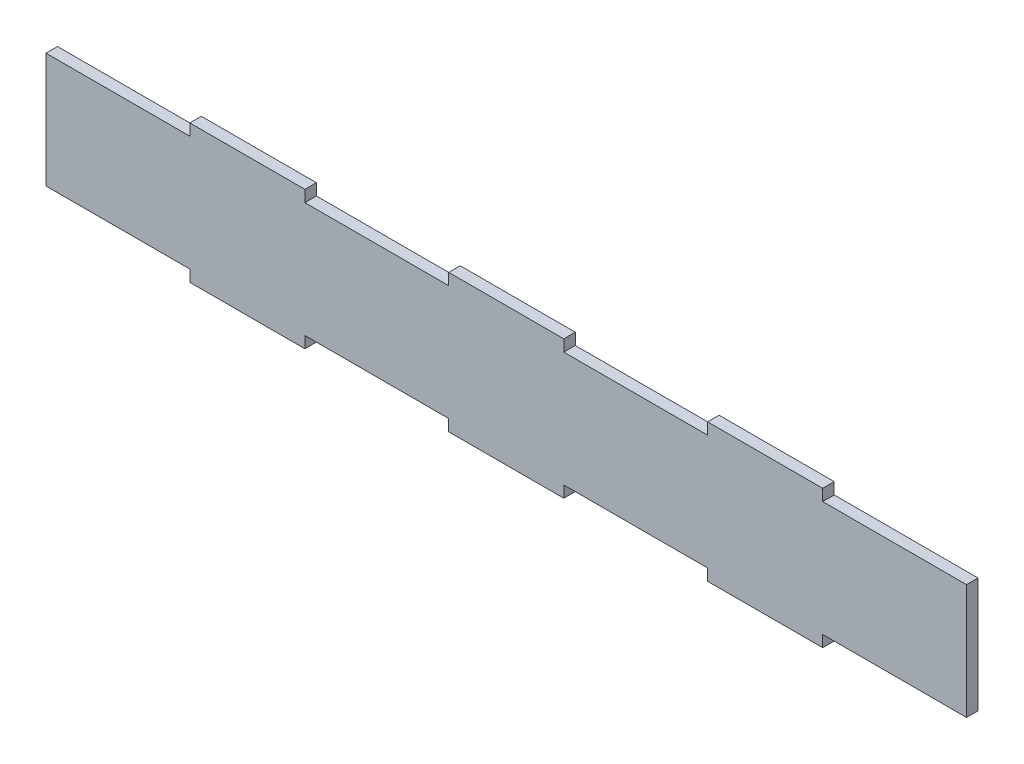
ISO-10303-21;
HEADER;
FILE_DESCRIPTION(('STEP AP214'),'2;1');
FILE_NAME('part.step','',(''),(''),'','','');
FILE_SCHEMA(('AUTOMOTIVE_DESIGN { 1 0 10303 214 1 1 1 1 }'));
ENDSEC;
DATA;
#1=APPLICATION_CONTEXT('core data for automotive mechanical design processes');
#2=APPLICATION_PROTOCOL_DEFINITION('international standard','automotive_design',2000,#1);
#3=PRODUCT_CONTEXT('',#1,'mechanical');
#4=PRODUCT('Part','Part','',(#3));
#5=PRODUCT_RELATED_PRODUCT_CATEGORY('part','',(#4));
#6=PRODUCT_DEFINITION_FORMATION('','',#4);
#7=PRODUCT_DEFINITION_CONTEXT('part definition',#1,'design');
#8=PRODUCT_DEFINITION('design','',#6,#7);
#9=PRODUCT_DEFINITION_SHAPE('','',#8);
#10=(LENGTH_UNIT() NAMED_UNIT(*) SI_UNIT(.MILLI.,.METRE.));
#11=(NAMED_UNIT(*) PLANE_ANGLE_UNIT() SI_UNIT($,.RADIAN.));
#12=(NAMED_UNIT(*) SI_UNIT($,.STERADIAN.) SOLID_ANGLE_UNIT());
#13=UNCERTAINTY_MEASURE_WITH_UNIT(LENGTH_MEASURE(1.E-05),#10,'distance_accuracy_value','');
#14=(GEOMETRIC_REPRESENTATION_CONTEXT(3) GLOBAL_UNCERTAINTY_ASSIGNED_CONTEXT((#13)) GLOBAL_UNIT_ASSIGNED_CONTEXT((#10,
#11,#12)) REPRESENTATION_CONTEXT('',''));
#15=CARTESIAN_POINT('',(0.,0.,0.));
#16=DIRECTION('',(0.,0.,1.));
#17=DIRECTION('',(1.,0.,0.));
#18=AXIS2_PLACEMENT_3D('',#15,#16,#17);
#19=CARTESIAN_POINT('',(0.,0.,2.));
#20=DIRECTION('',(0.,1.,0.));
#21=DIRECTION('',(0.,0.,1.));
#22=AXIS2_PLACEMENT_3D('',#19,#20,#21);
#23=PLANE('',#22);
#24=DIRECTION('',(1.,0.,0.));
#25=VECTOR('',#24,1.);
#26=CARTESIAN_POINT('',(0.,0.,0.));
#27=LINE('',#26,#25);
#28=CARTESIAN_POINT('',(115.,0.,0.));
#29=VERTEX_POINT('',#28);
#30=CARTESIAN_POINT('',(135.,0.,0.));
#31=VERTEX_POINT('',#30);
#32=EDGE_CURVE('E254',#29,#31,#27,.T.);
#33=ORIENTED_EDGE('',*,*,#32,.T.);
#34=DIRECTION('',(0.,0.,-1.));
#35=VECTOR('',#34,1.);
#36=CARTESIAN_POINT('',(135.,0.,2.));
#37=LINE('',#36,#35);
#38=CARTESIAN_POINT('',(135.,0.,2.));
#39=VERTEX_POINT('',#38);
#40=EDGE_CURVE('E11',#39,#31,#37,.T.);
#41=ORIENTED_EDGE('',*,*,#40,.F.);
#42=DIRECTION('',(1.,0.,0.));
#43=VECTOR('',#42,1.);
#44=CARTESIAN_POINT('',(0.,0.,2.));
#45=LINE('',#44,#43);
#46=CARTESIAN_POINT('',(115.,0.,2.));
#47=VERTEX_POINT('',#46);
#48=EDGE_CURVE('E324',#47,#39,#45,.T.);
#49=ORIENTED_EDGE('',*,*,#48,.F.);
#50=DIRECTION('',(0.,0.,-1.));
#51=VECTOR('',#50,1.);
#52=CARTESIAN_POINT('',(115.,0.,2.));
#53=LINE('',#52,#51);
#54=EDGE_CURVE('E52',#47,#29,#53,.T.);
#55=ORIENTED_EDGE('',*,*,#54,.T.);
#56=EDGE_LOOP('',(#33,#41,#49,#55));
#57=FACE_BOUND('',#56,.T.);
#58=ADVANCED_FACE('F35',(#57),#23,.F.);
#59=CARTESIAN_POINT('',(135.,0.,2.));
#60=DIRECTION('',(-1.,0.,0.));
#61=DIRECTION('',(0.,0.,1.));
#62=AXIS2_PLACEMENT_3D('',#59,#60,#61);
#63=PLANE('',#62);
#64=DIRECTION('',(0.,1.,0.));
#65=VECTOR('',#64,1.);
#66=CARTESIAN_POINT('',(135.,0.,0.));
#67=LINE('',#66,#65);
#68=CARTESIAN_POINT('',(135.,2.,0.));
#69=VERTEX_POINT('',#68);
#70=EDGE_CURVE('E256',#31,#69,#67,.T.);
#71=ORIENTED_EDGE('',*,*,#70,.T.);
#72=DIRECTION('',(0.,0.,-1.));
#73=VECTOR('',#72,1.);
#74=CARTESIAN_POINT('',(135.,2.,2.));
#75=LINE('',#74,#73);
#76=CARTESIAN_POINT('',(135.,2.,2.));
#77=VERTEX_POINT('',#76);
#78=EDGE_CURVE('E44',#77,#69,#75,.T.);
#79=ORIENTED_EDGE('',*,*,#78,.F.);
#80=DIRECTION('',(0.,1.,0.));
#81=VECTOR('',#80,1.);
#82=CARTESIAN_POINT('',(135.,0.,2.));
#83=LINE('',#82,#81);
#84=EDGE_CURVE('E151',#39,#77,#83,.T.);
#85=ORIENTED_EDGE('',*,*,#84,.F.);
#86=ORIENTED_EDGE('',*,*,#40,.T.);
#87=EDGE_LOOP('',(#71,#79,#85,#86));
#88=FACE_BOUND('',#87,.T.);
#89=ADVANCED_FACE('F37',(#88),#63,.F.);
#90=CARTESIAN_POINT('',(0.,2.,2.));
#91=DIRECTION('',(0.,-1.,0.));
#92=DIRECTION('',(0.,0.,-1.));
#93=AXIS2_PLACEMENT_3D('',#90,#91,#92);
#94=PLANE('',#93);
#95=DIRECTION('',(-1.,0.,0.));
#96=VECTOR('',#95,1.);
#97=CARTESIAN_POINT('',(0.,2.,0.));
#98=LINE('',#97,#96);
#99=CARTESIAN_POINT('',(160.,2.,0.));
#100=VERTEX_POINT('',#99);
#101=EDGE_CURVE('E261',#100,#69,#98,.T.);
#102=ORIENTED_EDGE('',*,*,#101,.F.);
#103=DIRECTION('',(0.,0.,-1.));
#104=VECTOR('',#103,1.);
#105=CARTESIAN_POINT('',(160.,2.,2.));
#106=LINE('',#105,#104);
#107=CARTESIAN_POINT('',(160.,2.,2.));
#108=VERTEX_POINT('',#107);
#109=EDGE_CURVE('E373',#108,#100,#106,.T.);
#110=ORIENTED_EDGE('',*,*,#109,.F.);
#111=DIRECTION('',(-1.,0.,0.));
#112=VECTOR('',#111,1.);
#113=CARTESIAN_POINT('',(0.,2.,2.));
#114=LINE('',#113,#112);
#115=EDGE_CURVE('E379',#108,#77,#114,.T.);
#116=ORIENTED_EDGE('',*,*,#115,.T.);
#117=ORIENTED_EDGE('',*,*,#78,.T.);
#118=EDGE_LOOP('',(#102,#110,#116,#117));
#119=FACE_BOUND('',#118,.T.);
#120=ADVANCED_FACE('F377',(#119),#94,.T.);
#121=CARTESIAN_POINT('',(160.,0.,2.));
#122=DIRECTION('',(-1.,0.,0.));
#123=DIRECTION('',(0.,0.,1.));
#124=AXIS2_PLACEMENT_3D('',#121,#122,#123);
#125=PLANE('',#124);
#126=DIRECTION('',(0.,1.,0.));
#127=VECTOR('',#126,1.);
#128=CARTESIAN_POINT('',(160.,0.,0.));
#129=LINE('',#128,#127);
#130=CARTESIAN_POINT('',(160.,22.,0.));
#131=VERTEX_POINT('',#130);
#132=EDGE_CURVE('E264',#100,#131,#129,.T.);
#133=ORIENTED_EDGE('',*,*,#132,.T.);
#134=DIRECTION('',(0.,0.,-1.));
#135=VECTOR('',#134,1.);
#136=CARTESIAN_POINT('',(160.,22.,2.));
#137=LINE('',#136,#135);
#138=CARTESIAN_POINT('',(160.,22.,2.));
#139=VERTEX_POINT('',#138);
#140=EDGE_CURVE('E370',#139,#131,#137,.T.);
#141=ORIENTED_EDGE('',*,*,#140,.F.);
#142=DIRECTION('',(0.,1.,0.));
#143=VECTOR('',#142,1.);
#144=CARTESIAN_POINT('',(160.,0.,2.));
#145=LINE('',#144,#143);
#146=EDGE_CURVE('E397',#108,#139,#145,.T.);
#147=ORIENTED_EDGE('',*,*,#146,.F.);
#148=ORIENTED_EDGE('',*,*,#109,.T.);
#149=EDGE_LOOP('',(#133,#141,#147,#148));
#150=FACE_BOUND('',#149,.T.);
#151=ADVANCED_FACE('F387',(#150),#125,.F.);
#152=CARTESIAN_POINT('',(0.,22.,2.));
#153=DIRECTION('',(0.,-1.,0.));
#154=DIRECTION('',(0.,0.,-1.));
#155=AXIS2_PLACEMENT_3D('',#152,#153,#154);
#156=PLANE('',#155);
#157=DIRECTION('',(-1.,0.,0.));
#158=VECTOR('',#157,1.);
#159=CARTESIAN_POINT('',(0.,22.,0.));
#160=LINE('',#159,#158);
#161=CARTESIAN_POINT('',(135.,22.,0.));
#162=VERTEX_POINT('',#161);
#163=EDGE_CURVE('E266',#131,#162,#160,.T.);
#164=ORIENTED_EDGE('',*,*,#163,.T.);
#165=DIRECTION('',(0.,0.,-1.));
#166=VECTOR('',#165,1.);
#167=CARTESIAN_POINT('',(135.,22.,2.));
#168=LINE('',#167,#166);
#169=CARTESIAN_POINT('',(135.,22.,2.));
#170=VERTEX_POINT('',#169);
#171=EDGE_CURVE('E368',#170,#162,#168,.T.);
#172=ORIENTED_EDGE('',*,*,#171,.F.);
#173=DIRECTION('',(-1.,0.,0.));
#174=VECTOR('',#173,1.);
#175=CARTESIAN_POINT('',(0.,22.,2.));
#176=LINE('',#175,#174);
#177=EDGE_CURVE('E393',#139,#170,#176,.T.);
#178=ORIENTED_EDGE('',*,*,#177,.F.);
#179=ORIENTED_EDGE('',*,*,#140,.T.);
#180=EDGE_LOOP('',(#164,#172,#178,#179));
#181=FACE_BOUND('',#180,.T.);
#182=ADVANCED_FACE('F391',(#181),#156,.F.);
#183=CARTESIAN_POINT('',(135.,0.,2.));
#184=DIRECTION('',(1.,0.,0.));
#185=DIRECTION('',(0.,0.,-1.));
#186=AXIS2_PLACEMENT_3D('',#183,#184,#185);
#187=PLANE('',#186);
#188=DIRECTION('',(0.,-1.,0.));
#189=VECTOR('',#188,1.);
#190=CARTESIAN_POINT('',(135.,0.,0.));
#191=LINE('',#190,#189);
#192=CARTESIAN_POINT('',(135.,24.,0.));
#193=VERTEX_POINT('',#192);
#194=EDGE_CURVE('E269',#193,#162,#191,.T.);
#195=ORIENTED_EDGE('',*,*,#194,.F.);
#196=DIRECTION('',(0.,0.,-1.));
#197=VECTOR('',#196,1.);
#198=CARTESIAN_POINT('',(135.,24.,2.));
#199=LINE('',#198,#197);
#200=CARTESIAN_POINT('',(135.,24.,2.));
#201=VERTEX_POINT('',#200);
#202=EDGE_CURVE('E366',#201,#193,#199,.T.);
#203=ORIENTED_EDGE('',*,*,#202,.F.);
#204=DIRECTION('',(0.,-1.,0.));
#205=VECTOR('',#204,1.);
#206=CARTESIAN_POINT('',(135.,0.,2.));
#207=LINE('',#206,#205);
#208=EDGE_CURVE('E396',#201,#170,#207,.T.);
#209=ORIENTED_EDGE('',*,*,#208,.T.);
#210=ORIENTED_EDGE('',*,*,#171,.T.);
#211=EDGE_LOOP('',(#195,#203,#209,#210));
#212=FACE_BOUND('',#211,.T.);
#213=ADVANCED_FACE('F541',(#212),#187,.T.);
#214=CARTESIAN_POINT('',(0.,24.,2.));
#215=DIRECTION('',(0.,1.,0.));
#216=DIRECTION('',(0.,0.,1.));
#217=AXIS2_PLACEMENT_3D('',#214,#215,#216);
#218=PLANE('',#217);
#219=DIRECTION('',(1.,0.,0.));
#220=VECTOR('',#219,1.);
#221=CARTESIAN_POINT('',(0.,24.,0.));
#222=LINE('',#221,#220);
#223=CARTESIAN_POINT('',(115.,24.,0.));
#224=VERTEX_POINT('',#223);
#225=EDGE_CURVE('E272',#224,#193,#222,.T.);
#226=ORIENTED_EDGE('',*,*,#225,.F.);
#227=DIRECTION('',(0.,0.,-1.));
#228=VECTOR('',#227,1.);
#229=CARTESIAN_POINT('',(115.,24.,2.));
#230=LINE('',#229,#228);
#231=CARTESIAN_POINT('',(115.,24.,2.));
#232=VERTEX_POINT('',#231);
#233=EDGE_CURVE('E364',#232,#224,#230,.T.);
#234=ORIENTED_EDGE('',*,*,#233,.F.);
#235=DIRECTION('',(1.,0.,0.));
#236=VECTOR('',#235,1.);
#237=CARTESIAN_POINT('',(0.,24.,2.));
#238=LINE('',#237,#236);
#239=EDGE_CURVE('E399',#232,#201,#238,.T.);
#240=ORIENTED_EDGE('',*,*,#239,.T.);
#241=ORIENTED_EDGE('',*,*,#202,.T.);
#242=EDGE_LOOP('',(#226,#234,#240,#241));
#243=FACE_BOUND('',#242,.T.);
#244=ADVANCED_FACE('F536',(#243),#218,.T.);
#245=CARTESIAN_POINT('',(115.,0.,2.));
#246=DIRECTION('',(1.,0.,0.));
#247=DIRECTION('',(0.,0.,-1.));
#248=AXIS2_PLACEMENT_3D('',#245,#246,#247);
#249=PLANE('',#248);
#250=DIRECTION('',(0.,-1.,0.));
#251=VECTOR('',#250,1.);
#252=CARTESIAN_POINT('',(115.,0.,0.));
#253=LINE('',#252,#251);
#254=CARTESIAN_POINT('',(115.,22.,0.));
#255=VERTEX_POINT('',#254);
#256=EDGE_CURVE('E275',#224,#255,#253,.T.);
#257=ORIENTED_EDGE('',*,*,#256,.T.);
#258=DIRECTION('',(0.,0.,-1.));
#259=VECTOR('',#258,1.);
#260=CARTESIAN_POINT('',(115.,22.,2.));
#261=LINE('',#260,#259);
#262=CARTESIAN_POINT('',(115.,22.,2.));
#263=VERTEX_POINT('',#262);
#264=EDGE_CURVE('E362',#263,#255,#261,.T.);
#265=ORIENTED_EDGE('',*,*,#264,.F.);
#266=DIRECTION('',(0.,-1.,0.));
#267=VECTOR('',#266,1.);
#268=CARTESIAN_POINT('',(115.,0.,2.));
#269=LINE('',#268,#267);
#270=EDGE_CURVE('E406',#232,#263,#269,.T.);
#271=ORIENTED_EDGE('',*,*,#270,.F.);
#272=ORIENTED_EDGE('',*,*,#233,.T.);
#273=EDGE_LOOP('',(#257,#265,#271,#272));
#274=FACE_BOUND('',#273,.T.);
#275=ADVANCED_FACE('F542',(#274),#249,.F.);
#276=CARTESIAN_POINT('',(0.,22.,2.));
#277=DIRECTION('',(0.,1.,0.));
#278=DIRECTION('',(-1.,0.,0.));
#279=AXIS2_PLACEMENT_3D('',#276,#277,#278);
#280=PLANE('',#279);
#281=DIRECTION('',(1.,0.,0.));
#282=VECTOR('',#281,1.);
#283=CARTESIAN_POINT('',(0.,22.,0.));
#284=LINE('',#283,#282);
#285=CARTESIAN_POINT('',(90.,22.,0.));
#286=VERTEX_POINT('',#285);
#287=EDGE_CURVE('E280',#286,#255,#284,.T.);
#288=ORIENTED_EDGE('',*,*,#287,.F.);
#289=DIRECTION('',(0.,0.,-1.));
#290=VECTOR('',#289,1.);
#291=CARTESIAN_POINT('',(90.,22.,2.));
#292=LINE('',#291,#290);
#293=CARTESIAN_POINT('',(90.,22.,2.));
#294=VERTEX_POINT('',#293);
#295=EDGE_CURVE('E360',#294,#286,#292,.T.);
#296=ORIENTED_EDGE('',*,*,#295,.F.);
#297=DIRECTION('',(1.,0.,0.));
#298=VECTOR('',#297,1.);
#299=CARTESIAN_POINT('',(0.,22.,2.));
#300=LINE('',#299,#298);
#301=EDGE_CURVE('E410',#294,#263,#300,.T.);
#302=ORIENTED_EDGE('',*,*,#301,.T.);
#303=ORIENTED_EDGE('',*,*,#264,.T.);
#304=EDGE_LOOP('',(#288,#296,#302,#303));
#305=FACE_BOUND('',#304,.T.);
#306=ADVANCED_FACE('F530',(#305),#280,.T.);
#307=CARTESIAN_POINT('',(90.,0.,2.));
#308=DIRECTION('',(1.,0.,0.));
#309=DIRECTION('',(0.,0.,-1.));
#310=AXIS2_PLACEMENT_3D('',#307,#308,#309);
#311=PLANE('',#310);
#312=DIRECTION('',(0.,-1.,0.));
#313=VECTOR('',#312,1.);
#314=CARTESIAN_POINT('',(90.,0.,0.));
#315=LINE('',#314,#313);
#316=CARTESIAN_POINT('',(90.,24.,0.));
#317=VERTEX_POINT('',#316);
#318=EDGE_CURVE('E283',#317,#286,#315,.T.);
#319=ORIENTED_EDGE('',*,*,#318,.F.);
#320=DIRECTION('',(0.,0.,-1.));
#321=VECTOR('',#320,1.);
#322=CARTESIAN_POINT('',(90.,24.,2.));
#323=LINE('',#322,#321);
#324=CARTESIAN_POINT('',(90.,24.,2.));
#325=VERTEX_POINT('',#324);
#326=EDGE_CURVE('E358',#325,#317,#323,.T.);
#327=ORIENTED_EDGE('',*,*,#326,.F.);
#328=DIRECTION('',(0.,-1.,0.));
#329=VECTOR('',#328,1.);
#330=CARTESIAN_POINT('',(90.,0.,2.));
#331=LINE('',#330,#329);
#332=EDGE_CURVE('E413',#325,#294,#331,.T.);
#333=ORIENTED_EDGE('',*,*,#332,.T.);
#334=ORIENTED_EDGE('',*,*,#295,.T.);
#335=EDGE_LOOP('',(#319,#327,#333,#334));
#336=FACE_BOUND('',#335,.T.);
#337=ADVANCED_FACE('F526',(#336),#311,.T.);
#338=CARTESIAN_POINT('',(70.,24.,0.));
#339=VERTEX_POINT('',#338);
#340=EDGE_CURVE('E277',#339,#317,#222,.T.);
#341=ORIENTED_EDGE('',*,*,#340,.F.);
#342=DIRECTION('',(0.,0.,-1.));
#343=VECTOR('',#342,1.);
#344=CARTESIAN_POINT('',(70.,24.,2.));
#345=LINE('',#344,#343);
#346=CARTESIAN_POINT('',(70.,24.,2.));
#347=VERTEX_POINT('',#346);
#348=EDGE_CURVE('E356',#347,#339,#345,.T.);
#349=ORIENTED_EDGE('',*,*,#348,.F.);
#350=EDGE_CURVE('E408',#347,#325,#238,.T.);
#351=ORIENTED_EDGE('',*,*,#350,.T.);
#352=ORIENTED_EDGE('',*,*,#326,.T.);
#353=EDGE_LOOP('',(#341,#349,#351,#352));
#354=FACE_BOUND('',#353,.T.);
#355=ADVANCED_FACE('F520',(#354),#218,.T.);
#356=CARTESIAN_POINT('',(70.,0.,2.));
#357=DIRECTION('',(1.,0.,0.));
#358=DIRECTION('',(0.,0.,-1.));
#359=AXIS2_PLACEMENT_3D('',#356,#357,#358);
#360=PLANE('',#359);
#361=DIRECTION('',(0.,-1.,0.));
#362=VECTOR('',#361,1.);
#363=CARTESIAN_POINT('',(70.,0.,0.));
#364=LINE('',#363,#362);
#365=CARTESIAN_POINT('',(70.,22.,0.));
#366=VERTEX_POINT('',#365);
#367=EDGE_CURVE('E286',#339,#366,#364,.T.);
#368=ORIENTED_EDGE('',*,*,#367,.T.);
#369=DIRECTION('',(0.,0.,-1.));
#370=VECTOR('',#369,1.);
#371=CARTESIAN_POINT('',(70.,22.,2.));
#372=LINE('',#371,#370);
#373=CARTESIAN_POINT('',(70.,22.,2.));
#374=VERTEX_POINT('',#373);
#375=EDGE_CURVE('E354',#374,#366,#372,.T.);
#376=ORIENTED_EDGE('',*,*,#375,.F.);
#377=DIRECTION('',(0.,-1.,0.));
#378=VECTOR('',#377,1.);
#379=CARTESIAN_POINT('',(70.,0.,2.));
#380=LINE('',#379,#378);
#381=EDGE_CURVE('E416',#347,#374,#380,.T.);
#382=ORIENTED_EDGE('',*,*,#381,.F.);
#383=ORIENTED_EDGE('',*,*,#348,.T.);
#384=EDGE_LOOP('',(#368,#376,#382,#383));
#385=FACE_BOUND('',#384,.T.);
#386=ADVANCED_FACE('F605',(#385),#360,.F.);
#387=CARTESIAN_POINT('',(0.,22.,2.));
#388=DIRECTION('',(0.,1.,0.));
#389=DIRECTION('',(0.,0.,1.));
#390=AXIS2_PLACEMENT_3D('',#387,#388,#389);
#391=PLANE('',#390);
#392=DIRECTION('',(1.,0.,0.));
#393=VECTOR('',#392,1.);
#394=CARTESIAN_POINT('',(0.,22.,0.));
#395=LINE('',#394,#393);
#396=CARTESIAN_POINT('',(45.,22.,0.));
#397=VERTEX_POINT('',#396);
#398=EDGE_CURVE('E289',#397,#366,#395,.T.);
#399=ORIENTED_EDGE('',*,*,#398,.F.);
#400=DIRECTION('',(0.,0.,-1.));
#401=VECTOR('',#400,1.);
#402=CARTESIAN_POINT('',(45.,22.,2.));
#403=LINE('',#402,#401);
#404=CARTESIAN_POINT('',(45.,22.,2.));
#405=VERTEX_POINT('',#404);
#406=EDGE_CURVE('E352',#405,#397,#403,.T.);
#407=ORIENTED_EDGE('',*,*,#406,.F.);
#408=DIRECTION('',(1.,0.,0.));
#409=VECTOR('',#408,1.);
#410=CARTESIAN_POINT('',(0.,22.,2.));
#411=LINE('',#410,#409);
#412=EDGE_CURVE('E418',#405,#374,#411,.T.);
#413=ORIENTED_EDGE('',*,*,#412,.T.);
#414=ORIENTED_EDGE('',*,*,#375,.T.);
#415=EDGE_LOOP('',(#399,#407,#413,#414));
#416=FACE_BOUND('',#415,.T.);
#417=ADVANCED_FACE('F613',(#416),#391,.T.);
#418=CARTESIAN_POINT('',(45.,0.,2.));
#419=DIRECTION('',(1.,0.,0.));
#420=DIRECTION('',(0.,0.,-1.));
#421=AXIS2_PLACEMENT_3D('',#418,#419,#420);
#422=PLANE('',#421);
#423=DIRECTION('',(0.,-1.,0.));
#424=VECTOR('',#423,1.);
#425=CARTESIAN_POINT('',(45.,0.,0.));
#426=LINE('',#425,#424);
#427=CARTESIAN_POINT('',(45.,24.,0.));
#428=VERTEX_POINT('',#427);
#429=EDGE_CURVE('E292',#428,#397,#426,.T.);
#430=ORIENTED_EDGE('',*,*,#429,.F.);
#431=DIRECTION('',(0.,0.,-1.));
#432=VECTOR('',#431,1.);
#433=CARTESIAN_POINT('',(45.,24.,2.));
#434=LINE('',#433,#432);
#435=CARTESIAN_POINT('',(45.,24.,2.));
#436=VERTEX_POINT('',#435);
#437=EDGE_CURVE('E350',#436,#428,#434,.T.);
#438=ORIENTED_EDGE('',*,*,#437,.F.);
#439=DIRECTION('',(0.,-1.,0.));
#440=VECTOR('',#439,1.);
#441=CARTESIAN_POINT('',(45.,0.,2.));
#442=LINE('',#441,#440);
#443=EDGE_CURVE('E421',#436,#405,#442,.T.);
#444=ORIENTED_EDGE('',*,*,#443,.T.);
#445=ORIENTED_EDGE('',*,*,#406,.T.);
#446=EDGE_LOOP('',(#430,#438,#444,#445));
#447=FACE_BOUND('',#446,.T.);
#448=ADVANCED_FACE('F623',(#447),#422,.T.);
#449=CARTESIAN_POINT('',(25.,24.,0.));
#450=VERTEX_POINT('',#449);
#451=EDGE_CURVE('E276',#450,#428,#222,.T.);
#452=ORIENTED_EDGE('',*,*,#451,.F.);
#453=DIRECTION('',(0.,0.,-1.));
#454=VECTOR('',#453,1.);
#455=CARTESIAN_POINT('',(25.,24.,2.));
#456=LINE('',#455,#454);
#457=CARTESIAN_POINT('',(25.,24.,2.));
#458=VERTEX_POINT('',#457);
#459=EDGE_CURVE('E348',#458,#450,#456,.T.);
#460=ORIENTED_EDGE('',*,*,#459,.F.);
#461=EDGE_CURVE('E407',#458,#436,#238,.T.);
#462=ORIENTED_EDGE('',*,*,#461,.T.);
#463=ORIENTED_EDGE('',*,*,#437,.T.);
#464=EDGE_LOOP('',(#452,#460,#462,#463));
#465=FACE_BOUND('',#464,.T.);
#466=ADVANCED_FACE('F511',(#465),#218,.T.);
#467=CARTESIAN_POINT('',(25.,0.,2.));
#468=DIRECTION('',(1.,0.,0.));
#469=DIRECTION('',(0.,0.,-1.));
#470=AXIS2_PLACEMENT_3D('',#467,#468,#469);
#471=PLANE('',#470);
#472=DIRECTION('',(0.,-1.,0.));
#473=VECTOR('',#472,1.);
#474=CARTESIAN_POINT('',(25.,0.,0.));
#475=LINE('',#474,#473);
#476=CARTESIAN_POINT('',(25.,22.,0.));
#477=VERTEX_POINT('',#476);
#478=EDGE_CURVE('E295',#450,#477,#475,.T.);
#479=ORIENTED_EDGE('',*,*,#478,.T.);
#480=DIRECTION('',(0.,0.,-1.));
#481=VECTOR('',#480,1.);
#482=CARTESIAN_POINT('',(25.,22.,2.));
#483=LINE('',#482,#481);
#484=CARTESIAN_POINT('',(25.,22.,2.));
#485=VERTEX_POINT('',#484);
#486=EDGE_CURVE('E346',#485,#477,#483,.T.);
#487=ORIENTED_EDGE('',*,*,#486,.F.);
#488=DIRECTION('',(0.,-1.,0.));
#489=VECTOR('',#488,1.);
#490=CARTESIAN_POINT('',(25.,0.,2.));
#491=LINE('',#490,#489);
#492=EDGE_CURVE('E424',#458,#485,#491,.T.);
#493=ORIENTED_EDGE('',*,*,#492,.F.);
#494=ORIENTED_EDGE('',*,*,#459,.T.);
#495=EDGE_LOOP('',(#479,#487,#493,#494));
#496=FACE_BOUND('',#495,.T.);
#497=ADVANCED_FACE('F642',(#496),#471,.F.);
#498=CARTESIAN_POINT('',(0.,22.,2.));
#499=DIRECTION('',(0.,1.,0.));
#500=DIRECTION('',(0.,0.,1.));
#501=AXIS2_PLACEMENT_3D('',#498,#499,#500);
#502=PLANE('',#501);
#503=DIRECTION('',(1.,0.,0.));
#504=VECTOR('',#503,1.);
#505=CARTESIAN_POINT('',(0.,22.,0.));
#506=LINE('',#505,#504);
#507=CARTESIAN_POINT('',(0.,22.,0.));
#508=VERTEX_POINT('',#507);
#509=EDGE_CURVE('E298',#508,#477,#506,.T.);
#510=ORIENTED_EDGE('',*,*,#509,.F.);
#511=DIRECTION('',(0.,0.,-1.));
#512=VECTOR('',#511,1.);
#513=CARTESIAN_POINT('',(0.,22.,2.));
#514=LINE('',#513,#512);
#515=CARTESIAN_POINT('',(0.,22.,2.));
#516=VERTEX_POINT('',#515);
#517=EDGE_CURVE('E344',#516,#508,#514,.T.);
#518=ORIENTED_EDGE('',*,*,#517,.F.);
#519=DIRECTION('',(1.,0.,0.));
#520=VECTOR('',#519,1.);
#521=CARTESIAN_POINT('',(0.,22.,2.));
#522=LINE('',#521,#520);
#523=EDGE_CURVE('E426',#516,#485,#522,.T.);
#524=ORIENTED_EDGE('',*,*,#523,.T.);
#525=ORIENTED_EDGE('',*,*,#486,.T.);
#526=EDGE_LOOP('',(#510,#518,#524,#525));
#527=FACE_BOUND('',#526,.T.);
#528=ADVANCED_FACE('F504',(#527),#502,.T.);
#529=CARTESIAN_POINT('',(0.,0.,2.));
#530=DIRECTION('',(-1.,0.,0.));
#531=DIRECTION('',(0.,0.,1.));
#532=AXIS2_PLACEMENT_3D('',#529,#530,#531);
#533=PLANE('',#532);
#534=DIRECTION('',(0.,1.,0.));
#535=VECTOR('',#534,1.);
#536=CARTESIAN_POINT('',(0.,0.,0.));
#537=LINE('',#536,#535);
#538=CARTESIAN_POINT('',(0.,2.,0.));
#539=VERTEX_POINT('',#538);
#540=EDGE_CURVE('E301',#539,#508,#537,.T.);
#541=ORIENTED_EDGE('',*,*,#540,.F.);
#542=DIRECTION('',(0.,0.,-1.));
#543=VECTOR('',#542,1.);
#544=CARTESIAN_POINT('',(0.,2.,2.));
#545=LINE('',#544,#543);
#546=CARTESIAN_POINT('',(0.,2.,2.));
#547=VERTEX_POINT('',#546);
#548=EDGE_CURVE('E342',#547,#539,#545,.T.);
#549=ORIENTED_EDGE('',*,*,#548,.F.);
#550=DIRECTION('',(0.,1.,0.));
#551=VECTOR('',#550,1.);
#552=CARTESIAN_POINT('',(0.,0.,2.));
#553=LINE('',#552,#551);
#554=EDGE_CURVE('E429',#547,#516,#553,.T.);
#555=ORIENTED_EDGE('',*,*,#554,.T.);
#556=ORIENTED_EDGE('',*,*,#517,.T.);
#557=EDGE_LOOP('',(#541,#549,#555,#556));
#558=FACE_BOUND('',#557,.T.);
#559=ADVANCED_FACE('F500',(#558),#533,.T.);
#560=CARTESIAN_POINT('',(0.,2.,2.));
#561=DIRECTION('',(0.,1.,0.));
#562=DIRECTION('',(0.,0.,1.));
#563=AXIS2_PLACEMENT_3D('',#560,#561,#562);
#564=PLANE('',#563);
#565=DIRECTION('',(1.,0.,0.));
#566=VECTOR('',#565,1.);
#567=CARTESIAN_POINT('',(0.,2.,0.));
#568=LINE('',#567,#566);
#569=CARTESIAN_POINT('',(25.,2.,0.));
#570=VERTEX_POINT('',#569);
#571=EDGE_CURVE('E304',#539,#570,#568,.T.);
#572=ORIENTED_EDGE('',*,*,#571,.T.);
#573=DIRECTION('',(0.,0.,-1.));
#574=VECTOR('',#573,1.);
#575=CARTESIAN_POINT('',(25.,2.,2.));
#576=LINE('',#575,#574);
#577=CARTESIAN_POINT('',(25.,2.,2.));
#578=VERTEX_POINT('',#577);
#579=EDGE_CURVE('E340',#578,#570,#576,.T.);
#580=ORIENTED_EDGE('',*,*,#579,.F.);
#581=DIRECTION('',(1.,0.,0.));
#582=VECTOR('',#581,1.);
#583=CARTESIAN_POINT('',(0.,2.,2.));
#584=LINE('',#583,#582);
#585=EDGE_CURVE('E432',#547,#578,#584,.T.);
#586=ORIENTED_EDGE('',*,*,#585,.F.);
#587=ORIENTED_EDGE('',*,*,#548,.T.);
#588=EDGE_LOOP('',(#572,#580,#586,#587));
#589=FACE_BOUND('',#588,.T.);
#590=ADVANCED_FACE('F666',(#589),#564,.F.);
#591=CARTESIAN_POINT('',(25.,0.,2.));
#592=DIRECTION('',(-1.,0.,0.));
#593=DIRECTION('',(0.,0.,1.));
#594=AXIS2_PLACEMENT_3D('',#591,#592,#593);
#595=PLANE('',#594);
#596=DIRECTION('',(0.,1.,0.));
#597=VECTOR('',#596,1.);
#598=CARTESIAN_POINT('',(25.,0.,0.));
#599=LINE('',#598,#597);
#600=CARTESIAN_POINT('',(25.,0.,0.));
#601=VERTEX_POINT('',#600);
#602=EDGE_CURVE('E307',#601,#570,#599,.T.);
#603=ORIENTED_EDGE('',*,*,#602,.F.);
#604=DIRECTION('',(0.,0.,-1.));
#605=VECTOR('',#604,1.);
#606=CARTESIAN_POINT('',(25.,0.,2.));
#607=LINE('',#606,#605);
#608=CARTESIAN_POINT('',(25.,0.,2.));
#609=VERTEX_POINT('',#608);
#610=EDGE_CURVE('E338',#609,#601,#607,.T.);
#611=ORIENTED_EDGE('',*,*,#610,.F.);
#612=DIRECTION('',(0.,1.,0.));
#613=VECTOR('',#612,1.);
#614=CARTESIAN_POINT('',(25.,0.,2.));
#615=LINE('',#614,#613);
#616=EDGE_CURVE('E434',#609,#578,#615,.T.);
#617=ORIENTED_EDGE('',*,*,#616,.T.);
#618=ORIENTED_EDGE('',*,*,#579,.T.);
#619=EDGE_LOOP('',(#603,#611,#617,#618));
#620=FACE_BOUND('',#619,.T.);
#621=ADVANCED_FACE('F467',(#620),#595,.T.);
#622=CARTESIAN_POINT('',(45.,0.,0.));
#623=VERTEX_POINT('',#622);
#624=EDGE_CURVE('E258',#601,#623,#27,.T.);
#625=ORIENTED_EDGE('',*,*,#624,.T.);
#626=DIRECTION('',(0.,0.,-1.));
#627=VECTOR('',#626,1.);
#628=CARTESIAN_POINT('',(45.,0.,2.));
#629=LINE('',#628,#627);
#630=CARTESIAN_POINT('',(45.,0.,2.));
#631=VERTEX_POINT('',#630);
#632=EDGE_CURVE('E335',#631,#623,#629,.T.);
#633=ORIENTED_EDGE('',*,*,#632,.F.);
#634=EDGE_CURVE('E437',#609,#631,#45,.T.);
#635=ORIENTED_EDGE('',*,*,#634,.F.);
#636=ORIENTED_EDGE('',*,*,#610,.T.);
#637=EDGE_LOOP('',(#625,#633,#635,#636));
#638=FACE_BOUND('',#637,.T.);
#639=ADVANCED_FACE('F458',(#638),#23,.F.);
#640=CARTESIAN_POINT('',(45.,0.,2.));
#641=DIRECTION('',(-1.,0.,0.));
#642=DIRECTION('',(0.,0.,1.));
#643=AXIS2_PLACEMENT_3D('',#640,#641,#642);
#644=PLANE('',#643);
#645=DIRECTION('',(0.,1.,0.));
#646=VECTOR('',#645,1.);
#647=CARTESIAN_POINT('',(45.,0.,0.));
#648=LINE('',#647,#646);
#649=CARTESIAN_POINT('',(45.,2.,0.));
#650=VERTEX_POINT('',#649);
#651=EDGE_CURVE('E310',#623,#650,#648,.T.);
#652=ORIENTED_EDGE('',*,*,#651,.T.);
#653=DIRECTION('',(0.,0.,-1.));
#654=VECTOR('',#653,1.);
#655=CARTESIAN_POINT('',(45.,2.,2.));
#656=LINE('',#655,#654);
#657=CARTESIAN_POINT('',(45.,2.,2.));
#658=VERTEX_POINT('',#657);
#659=EDGE_CURVE('E332',#658,#650,#656,.T.);
#660=ORIENTED_EDGE('',*,*,#659,.F.);
#661=DIRECTION('',(0.,1.,0.));
#662=VECTOR('',#661,1.);
#663=CARTESIAN_POINT('',(45.,0.,2.));
#664=LINE('',#663,#662);
#665=EDGE_CURVE('E438',#631,#658,#664,.T.);
#666=ORIENTED_EDGE('',*,*,#665,.F.);
#667=ORIENTED_EDGE('',*,*,#632,.T.);
#668=EDGE_LOOP('',(#652,#660,#666,#667));
#669=FACE_BOUND('',#668,.T.);
#670=ADVANCED_FACE('F466',(#669),#644,.F.);
#671=CARTESIAN_POINT('',(0.,2.,2.));
#672=DIRECTION('',(0.,1.,0.));
#673=DIRECTION('',(0.,0.,1.));
#674=AXIS2_PLACEMENT_3D('',#671,#672,#673);
#675=PLANE('',#674);
#676=DIRECTION('',(1.,0.,0.));
#677=VECTOR('',#676,1.);
#678=CARTESIAN_POINT('',(0.,2.,0.));
#679=LINE('',#678,#677);
#680=CARTESIAN_POINT('',(70.,2.,0.));
#681=VERTEX_POINT('',#680);
#682=EDGE_CURVE('E312',#650,#681,#679,.T.);
#683=ORIENTED_EDGE('',*,*,#682,.T.);
#684=DIRECTION('',(0.,0.,-1.));
#685=VECTOR('',#684,1.);
#686=CARTESIAN_POINT('',(70.,2.,2.));
#687=LINE('',#686,#685);
#688=CARTESIAN_POINT('',(70.,2.,2.));
#689=VERTEX_POINT('',#688);
#690=EDGE_CURVE('E330',#689,#681,#687,.T.);
#691=ORIENTED_EDGE('',*,*,#690,.F.);
#692=DIRECTION('',(1.,0.,0.));
#693=VECTOR('',#692,1.);
#694=CARTESIAN_POINT('',(0.,2.,2.));
#695=LINE('',#694,#693);
#696=EDGE_CURVE('E440',#658,#689,#695,.T.);
#697=ORIENTED_EDGE('',*,*,#696,.F.);
#698=ORIENTED_EDGE('',*,*,#659,.T.);
#699=EDGE_LOOP('',(#683,#691,#697,#698));
#700=FACE_BOUND('',#699,.T.);
#701=ADVANCED_FACE('F476',(#700),#675,.F.);
#702=CARTESIAN_POINT('',(70.,0.,2.));
#703=DIRECTION('',(-1.,0.,0.));
#704=DIRECTION('',(0.,0.,1.));
#705=AXIS2_PLACEMENT_3D('',#702,#703,#704);
#706=PLANE('',#705);
#707=DIRECTION('',(0.,1.,0.));
#708=VECTOR('',#707,1.);
#709=CARTESIAN_POINT('',(70.,0.,0.));
#710=LINE('',#709,#708);
#711=CARTESIAN_POINT('',(70.,0.,0.));
#712=VERTEX_POINT('',#711);
#713=EDGE_CURVE('E315',#712,#681,#710,.T.);
#714=ORIENTED_EDGE('',*,*,#713,.F.);
#715=DIRECTION('',(0.,0.,-1.));
#716=VECTOR('',#715,1.);
#717=CARTESIAN_POINT('',(70.,0.,2.));
#718=LINE('',#717,#716);
#719=CARTESIAN_POINT('',(70.,0.,2.));
#720=VERTEX_POINT('',#719);
#721=EDGE_CURVE('E328',#720,#712,#718,.T.);
#722=ORIENTED_EDGE('',*,*,#721,.F.);
#723=DIRECTION('',(0.,1.,0.));
#724=VECTOR('',#723,1.);
#725=CARTESIAN_POINT('',(70.,0.,2.));
#726=LINE('',#725,#724);
#727=EDGE_CURVE('E441',#720,#689,#726,.T.);
#728=ORIENTED_EDGE('',*,*,#727,.T.);
#729=ORIENTED_EDGE('',*,*,#690,.T.);
#730=EDGE_LOOP('',(#714,#722,#728,#729));
#731=FACE_BOUND('',#730,.T.);
#732=ADVANCED_FACE('F470',(#731),#706,.T.);
#733=CARTESIAN_POINT('',(90.,0.,0.));
#734=VERTEX_POINT('',#733);
#735=EDGE_CURVE('E257',#712,#734,#27,.T.);
#736=ORIENTED_EDGE('',*,*,#735,.T.);
#737=DIRECTION('',(0.,0.,-1.));
#738=VECTOR('',#737,1.);
#739=CARTESIAN_POINT('',(90.,0.,2.));
#740=LINE('',#739,#738);
#741=CARTESIAN_POINT('',(90.,0.,2.));
#742=VERTEX_POINT('',#741);
#743=EDGE_CURVE('E246',#742,#734,#740,.T.);
#744=ORIENTED_EDGE('',*,*,#743,.F.);
#745=EDGE_CURVE('E234',#720,#742,#45,.T.);
#746=ORIENTED_EDGE('',*,*,#745,.F.);
#747=ORIENTED_EDGE('',*,*,#721,.T.);
#748=EDGE_LOOP('',(#736,#744,#746,#747));
#749=FACE_BOUND('',#748,.T.);
#750=ADVANCED_FACE('F459',(#749),#23,.F.);
#751=CARTESIAN_POINT('',(90.,0.,2.));
#752=DIRECTION('',(-1.,0.,0.));
#753=DIRECTION('',(0.,0.,1.));
#754=AXIS2_PLACEMENT_3D('',#751,#752,#753);
#755=PLANE('',#754);
#756=DIRECTION('',(0.,1.,0.));
#757=VECTOR('',#756,1.);
#758=CARTESIAN_POINT('',(90.,0.,0.));
#759=LINE('',#758,#757);
#760=CARTESIAN_POINT('',(90.,2.,0.));
#761=VERTEX_POINT('',#760);
#762=EDGE_CURVE('E243',#734,#761,#759,.T.);
#763=ORIENTED_EDGE('',*,*,#762,.T.);
#764=DIRECTION('',(0.,0.,-1.));
#765=VECTOR('',#764,1.);
#766=CARTESIAN_POINT('',(90.,2.,2.));
#767=LINE('',#766,#765);
#768=CARTESIAN_POINT('',(90.,2.,2.));
#769=VERTEX_POINT('',#768);
#770=EDGE_CURVE('E240',#769,#761,#767,.T.);
#771=ORIENTED_EDGE('',*,*,#770,.F.);
#772=DIRECTION('',(0.,1.,0.));
#773=VECTOR('',#772,1.);
#774=CARTESIAN_POINT('',(90.,0.,2.));
#775=LINE('',#774,#773);
#776=EDGE_CURVE('E226',#742,#769,#775,.T.);
#777=ORIENTED_EDGE('',*,*,#776,.F.);
#778=ORIENTED_EDGE('',*,*,#743,.T.);
#779=EDGE_LOOP('',(#763,#771,#777,#778));
#780=FACE_BOUND('',#779,.T.);
#781=ADVANCED_FACE('F241',(#780),#755,.F.);
#782=CARTESIAN_POINT('',(0.,2.,2.));
#783=DIRECTION('',(0.,1.,0.));
#784=DIRECTION('',(0.,0.,1.));
#785=AXIS2_PLACEMENT_3D('',#782,#783,#784);
#786=PLANE('',#785);
#787=DIRECTION('',(1.,0.,0.));
#788=VECTOR('',#787,1.);
#789=CARTESIAN_POINT('',(0.,2.,0.));
#790=LINE('',#789,#788);
#791=CARTESIAN_POINT('',(115.,2.,0.));
#792=VERTEX_POINT('',#791);
#793=EDGE_CURVE('E319',#761,#792,#790,.T.);
#794=ORIENTED_EDGE('',*,*,#793,.T.);
#795=DIRECTION('',(0.,0.,-1.));
#796=VECTOR('',#795,1.);
#797=CARTESIAN_POINT('',(115.,2.,2.));
#798=LINE('',#797,#796);
#799=CARTESIAN_POINT('',(115.,2.,2.));
#800=VERTEX_POINT('',#799);
#801=EDGE_CURVE('E139',#800,#792,#798,.T.);
#802=ORIENTED_EDGE('',*,*,#801,.F.);
#803=DIRECTION('',(1.,0.,0.));
#804=VECTOR('',#803,1.);
#805=CARTESIAN_POINT('',(0.,2.,2.));
#806=LINE('',#805,#804);
#807=EDGE_CURVE('E231',#769,#800,#806,.T.);
#808=ORIENTED_EDGE('',*,*,#807,.F.);
#809=ORIENTED_EDGE('',*,*,#770,.T.);
#810=EDGE_LOOP('',(#794,#802,#808,#809));
#811=FACE_BOUND('',#810,.T.);
#812=ADVANCED_FACE('F248',(#811),#786,.F.);
#813=CARTESIAN_POINT('',(115.,0.,2.));
#814=DIRECTION('',(-1.,0.,0.));
#815=DIRECTION('',(0.,0.,1.));
#816=AXIS2_PLACEMENT_3D('',#813,#814,#815);
#817=PLANE('',#816);
#818=DIRECTION('',(0.,1.,0.));
#819=VECTOR('',#818,1.);
#820=CARTESIAN_POINT('',(115.,0.,0.));
#821=LINE('',#820,#819);
#822=EDGE_CURVE('E321',#29,#792,#821,.T.);
#823=ORIENTED_EDGE('',*,*,#822,.F.);
#824=ORIENTED_EDGE('',*,*,#54,.F.);
#825=DIRECTION('',(0.,1.,0.));
#826=VECTOR('',#825,1.);
#827=CARTESIAN_POINT('',(115.,0.,2.));
#828=LINE('',#827,#826);
#829=EDGE_CURVE('E249',#47,#800,#828,.T.);
#830=ORIENTED_EDGE('',*,*,#829,.T.);
#831=ORIENTED_EDGE('',*,*,#801,.T.);
#832=EDGE_LOOP('',(#823,#824,#830,#831));
#833=FACE_BOUND('',#832,.T.);
#834=ADVANCED_FACE('F446',(#833),#817,.T.);
#835=CARTESIAN_POINT('',(0.,0.,2.));
#836=DIRECTION('',(0.,0.,1.));
#837=DIRECTION('',(1.,0.,0.));
#838=AXIS2_PLACEMENT_3D('',#835,#836,#837);
#839=PLANE('',#838);
#840=ORIENTED_EDGE('',*,*,#48,.T.);
#841=ORIENTED_EDGE('',*,*,#84,.T.);
#842=ORIENTED_EDGE('',*,*,#115,.F.);
#843=ORIENTED_EDGE('',*,*,#146,.T.);
#844=ORIENTED_EDGE('',*,*,#177,.T.);
#845=ORIENTED_EDGE('',*,*,#208,.F.);
#846=ORIENTED_EDGE('',*,*,#239,.F.);
#847=ORIENTED_EDGE('',*,*,#270,.T.);
#848=ORIENTED_EDGE('',*,*,#301,.F.);
#849=ORIENTED_EDGE('',*,*,#332,.F.);
#850=ORIENTED_EDGE('',*,*,#350,.F.);
#851=ORIENTED_EDGE('',*,*,#381,.T.);
#852=ORIENTED_EDGE('',*,*,#412,.F.);
#853=ORIENTED_EDGE('',*,*,#443,.F.);
#854=ORIENTED_EDGE('',*,*,#461,.F.);
#855=ORIENTED_EDGE('',*,*,#492,.T.);
#856=ORIENTED_EDGE('',*,*,#523,.F.);
#857=ORIENTED_EDGE('',*,*,#554,.F.);
#858=ORIENTED_EDGE('',*,*,#585,.T.);
#859=ORIENTED_EDGE('',*,*,#616,.F.);
#860=ORIENTED_EDGE('',*,*,#634,.T.);
#861=ORIENTED_EDGE('',*,*,#665,.T.);
#862=ORIENTED_EDGE('',*,*,#696,.T.);
#863=ORIENTED_EDGE('',*,*,#727,.F.);
#864=ORIENTED_EDGE('',*,*,#745,.T.);
#865=ORIENTED_EDGE('',*,*,#776,.T.);
#866=ORIENTED_EDGE('',*,*,#807,.T.);
#867=ORIENTED_EDGE('',*,*,#829,.F.);
#868=EDGE_LOOP('',(#840,#841,#842,#843,#844,#845,#846,#847,#848,#849,#850,#851,#852,#853,#854,
#855,#856,#857,#858,#859,#860,#861,#862,#863,#864,#865,#866,#867));
#869=FACE_BOUND('',#868,.T.);
#870=ADVANCED_FACE('F228',(#869),#839,.T.);
#871=CARTESIAN_POINT('',(0.,0.,0.));
#872=DIRECTION('',(0.,0.,1.));
#873=DIRECTION('',(1.,0.,0.));
#874=AXIS2_PLACEMENT_3D('',#871,#872,#873);
#875=PLANE('',#874);
#876=ORIENTED_EDGE('',*,*,#32,.F.);
#877=ORIENTED_EDGE('',*,*,#822,.T.);
#878=ORIENTED_EDGE('',*,*,#793,.F.);
#879=ORIENTED_EDGE('',*,*,#762,.F.);
#880=ORIENTED_EDGE('',*,*,#735,.F.);
#881=ORIENTED_EDGE('',*,*,#713,.T.);
#882=ORIENTED_EDGE('',*,*,#682,.F.);
#883=ORIENTED_EDGE('',*,*,#651,.F.);
#884=ORIENTED_EDGE('',*,*,#624,.F.);
#885=ORIENTED_EDGE('',*,*,#602,.T.);
#886=ORIENTED_EDGE('',*,*,#571,.F.);
#887=ORIENTED_EDGE('',*,*,#540,.T.);
#888=ORIENTED_EDGE('',*,*,#509,.T.);
#889=ORIENTED_EDGE('',*,*,#478,.F.);
#890=ORIENTED_EDGE('',*,*,#451,.T.);
#891=ORIENTED_EDGE('',*,*,#429,.T.);
#892=ORIENTED_EDGE('',*,*,#398,.T.);
#893=ORIENTED_EDGE('',*,*,#367,.F.);
#894=ORIENTED_EDGE('',*,*,#340,.T.);
#895=ORIENTED_EDGE('',*,*,#318,.T.);
#896=ORIENTED_EDGE('',*,*,#287,.T.);
#897=ORIENTED_EDGE('',*,*,#256,.F.);
#898=ORIENTED_EDGE('',*,*,#225,.T.);
#899=ORIENTED_EDGE('',*,*,#194,.T.);
#900=ORIENTED_EDGE('',*,*,#163,.F.);
#901=ORIENTED_EDGE('',*,*,#132,.F.);
#902=ORIENTED_EDGE('',*,*,#101,.T.);
#903=ORIENTED_EDGE('',*,*,#70,.F.);
#904=EDGE_LOOP('',(#876,#877,#878,#879,#880,#881,#882,#883,#884,#885,#886,#887,#888,#889,#890,
#891,#892,#893,#894,#895,#896,#897,#898,#899,#900,#901,#902,#903));
#905=FACE_BOUND('',#904,.T.);
#906=ADVANCED_FACE('F383',(#905),#875,.F.);
#907=CLOSED_SHELL('',(#58,#89,#120,#151,#182,#213,#244,#275,#306,#337,#355,#386,#417,#448,#466,
#497,#528,#559,#590,#621,#639,#670,#701,#732,#750,#781,#812,#834,#870,#906));
#908=MANIFOLD_SOLID_BREP('B2',#907);
#909=ADVANCED_BREP_SHAPE_REPRESENTATION('',(#18,#908),#14);
#910=SHAPE_DEFINITION_REPRESENTATION(#9,#909);
ENDSEC;
END-ISO-10303-21;
